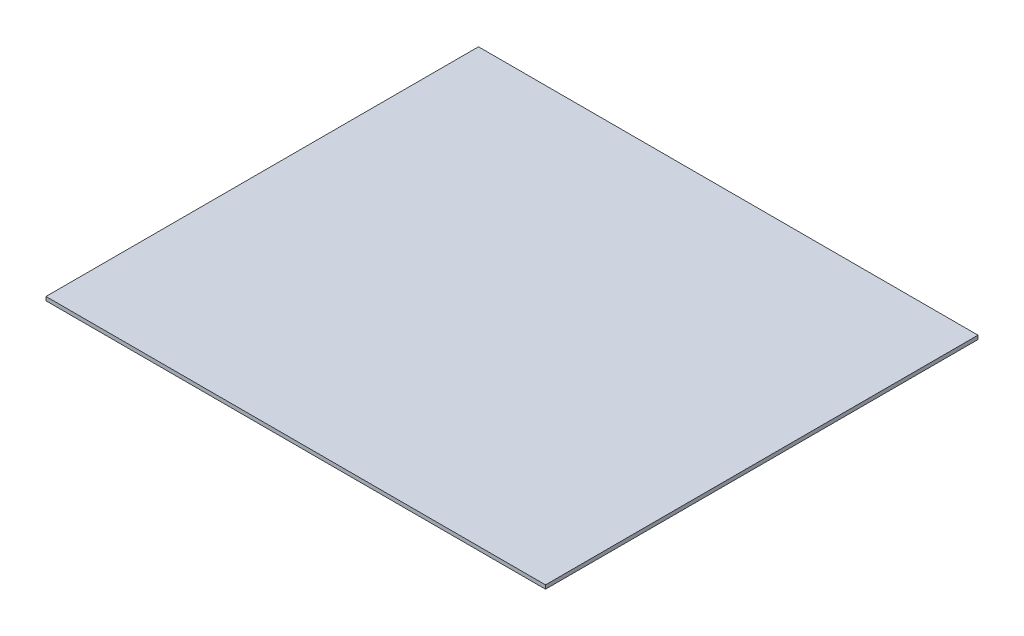
ISO-10303-21;
HEADER;
FILE_DESCRIPTION(('STEP AP214'),'2;1');
FILE_NAME('part.step','',(''),(''),'','','');
FILE_SCHEMA(('AUTOMOTIVE_DESIGN { 1 0 10303 214 1 1 1 1 }'));
ENDSEC;
DATA;
#1=APPLICATION_CONTEXT('core data for automotive mechanical design processes');
#2=APPLICATION_PROTOCOL_DEFINITION('international standard','automotive_design',2000,#1);
#3=PRODUCT_CONTEXT('',#1,'mechanical');
#4=PRODUCT('Part','Part','',(#3));
#5=PRODUCT_RELATED_PRODUCT_CATEGORY('part','',(#4));
#6=PRODUCT_DEFINITION_FORMATION('','',#4);
#7=PRODUCT_DEFINITION_CONTEXT('part definition',#1,'design');
#8=PRODUCT_DEFINITION('design','',#6,#7);
#9=PRODUCT_DEFINITION_SHAPE('','',#8);
#10=(LENGTH_UNIT() NAMED_UNIT(*) SI_UNIT(.MILLI.,.METRE.));
#11=(NAMED_UNIT(*) PLANE_ANGLE_UNIT() SI_UNIT($,.RADIAN.));
#12=(NAMED_UNIT(*) SI_UNIT($,.STERADIAN.) SOLID_ANGLE_UNIT());
#13=UNCERTAINTY_MEASURE_WITH_UNIT(LENGTH_MEASURE(1.E-05),#10,'distance_accuracy_value','');
#14=(GEOMETRIC_REPRESENTATION_CONTEXT(3) GLOBAL_UNCERTAINTY_ASSIGNED_CONTEXT((#13)) GLOBAL_UNIT_ASSIGNED_CONTEXT((#10,
#11,#12)) REPRESENTATION_CONTEXT('',''));
#15=CARTESIAN_POINT('',(0.,0.,0.));
#16=DIRECTION('',(0.,0.,1.));
#17=DIRECTION('',(1.,0.,0.));
#18=AXIS2_PLACEMENT_3D('',#15,#16,#17);
#19=CARTESIAN_POINT('',(-96.9721767594109,-0.01,-156.459901800327));
#20=DIRECTION('',(-1.,0.,0.));
#21=DIRECTION('',(0.,0.,1.));
#22=AXIS2_PLACEMENT_3D('',#19,#20,#21);
#23=PLANE('',#22);
#24=DIRECTION('',(0.,0.,1.));
#25=VECTOR('',#24,1.);
#26=CARTESIAN_POINT('',(-96.9721767594109,0.,0.));
#27=LINE('',#26,#25);
#28=CARTESIAN_POINT('',(-96.972176759411,0.,-156.459901800327));
#29=VERTEX_POINT('',#28);
#30=CARTESIAN_POINT('',(-96.972176759411,0.,185.540098199673));
#31=VERTEX_POINT('',#30);
#32=EDGE_CURVE('E90',#29,#31,#27,.T.);
#33=ORIENTED_EDGE('',*,*,#32,.F.);
#34=DIRECTION('',(0.,-1.,0.));
#35=VECTOR('',#34,1.);
#36=CARTESIAN_POINT('',(-96.9721767594109,3.,-156.459901800327));
#37=LINE('',#36,#35);
#38=CARTESIAN_POINT('',(-96.972176759411,3.,-156.459901800327));
#39=VERTEX_POINT('',#38);
#40=EDGE_CURVE('E94',#39,#29,#37,.T.);
#41=ORIENTED_EDGE('',*,*,#40,.F.);
#42=DIRECTION('',(0.,0.,1.));
#43=VECTOR('',#42,1.);
#44=CARTESIAN_POINT('',(-96.9721767594109,3.,0.));
#45=LINE('',#44,#43);
#46=CARTESIAN_POINT('',(-96.972176759411,3.,185.540098199673));
#47=VERTEX_POINT('',#46);
#48=EDGE_CURVE('E11',#39,#47,#45,.T.);
#49=ORIENTED_EDGE('',*,*,#48,.T.);
#50=DIRECTION('',(0.,1.,0.));
#51=VECTOR('',#50,1.);
#52=CARTESIAN_POINT('',(-96.9721767594109,3.,185.540098199673));
#53=LINE('',#52,#51);
#54=EDGE_CURVE('E37',#31,#47,#53,.T.);
#55=ORIENTED_EDGE('',*,*,#54,.F.);
#56=EDGE_LOOP('',(#33,#41,#49,#55));
#57=FACE_BOUND('',#56,.T.);
#58=ADVANCED_FACE('F34',(#57),#23,.F.);
#59=CARTESIAN_POINT('',(-491.972176759411,3.,-156.459901800327));
#60=DIRECTION('',(1.,0.,0.));
#61=DIRECTION('',(0.,0.,-1.));
#62=AXIS2_PLACEMENT_3D('',#59,#60,#61);
#63=PLANE('',#62);
#64=DIRECTION('',(0.,0.,1.));
#65=VECTOR('',#64,1.);
#66=CARTESIAN_POINT('',(-491.972176759411,0.,-156.459901800327));
#67=LINE('',#66,#65);
#68=CARTESIAN_POINT('',(-491.972176759411,0.,-156.459901800327));
#69=VERTEX_POINT('',#68);
#70=CARTESIAN_POINT('',(-491.972176759411,0.,185.540098199673));
#71=VERTEX_POINT('',#70);
#72=EDGE_CURVE('E89',#69,#71,#67,.T.);
#73=ORIENTED_EDGE('',*,*,#72,.T.);
#74=DIRECTION('',(0.,-1.,0.));
#75=VECTOR('',#74,1.);
#76=CARTESIAN_POINT('',(-491.972176759411,3.,185.540098199673));
#77=LINE('',#76,#75);
#78=CARTESIAN_POINT('',(-491.972176759411,3.,185.540098199673));
#79=VERTEX_POINT('',#78);
#80=EDGE_CURVE('E74',#79,#71,#77,.T.);
#81=ORIENTED_EDGE('',*,*,#80,.F.);
#82=DIRECTION('',(0.,0.,1.));
#83=VECTOR('',#82,1.);
#84=CARTESIAN_POINT('',(-491.972176759411,3.,-156.459901800327));
#85=LINE('',#84,#83);
#86=CARTESIAN_POINT('',(-491.972176759411,3.,-156.459901800327));
#87=VERTEX_POINT('',#86);
#88=EDGE_CURVE('E77',#87,#79,#85,.T.);
#89=ORIENTED_EDGE('',*,*,#88,.F.);
#90=DIRECTION('',(0.,-1.,0.));
#91=VECTOR('',#90,1.);
#92=CARTESIAN_POINT('',(-491.972176759411,3.,-156.459901800327));
#93=LINE('',#92,#91);
#94=EDGE_CURVE('E91',#87,#69,#93,.T.);
#95=ORIENTED_EDGE('',*,*,#94,.T.);
#96=EDGE_LOOP('',(#73,#81,#89,#95));
#97=FACE_BOUND('',#96,.T.);
#98=ADVANCED_FACE('F87',(#97),#63,.F.);
#99=CARTESIAN_POINT('',(-491.972176759411,3.,185.540098199673));
#100=DIRECTION('',(0.,0.,-1.));
#101=DIRECTION('',(-1.,0.,0.));
#102=AXIS2_PLACEMENT_3D('',#99,#100,#101);
#103=PLANE('',#102);
#104=DIRECTION('',(1.,0.,0.));
#105=VECTOR('',#104,1.);
#106=CARTESIAN_POINT('',(-491.972176759411,0.,185.540098199673));
#107=LINE('',#106,#105);
#108=EDGE_CURVE('E105',#71,#31,#107,.T.);
#109=ORIENTED_EDGE('',*,*,#108,.T.);
#110=ORIENTED_EDGE('',*,*,#54,.T.);
#111=DIRECTION('',(1.,0.,0.));
#112=VECTOR('',#111,1.);
#113=CARTESIAN_POINT('',(-491.972176759411,3.,185.540098199673));
#114=LINE('',#113,#112);
#115=EDGE_CURVE('E70',#79,#47,#114,.T.);
#116=ORIENTED_EDGE('',*,*,#115,.F.);
#117=ORIENTED_EDGE('',*,*,#80,.T.);
#118=EDGE_LOOP('',(#109,#110,#116,#117));
#119=FACE_BOUND('',#118,.T.);
#120=ADVANCED_FACE('F72',(#119),#103,.F.);
#121=CARTESIAN_POINT('',(-491.972176759411,3.,-156.459901800327));
#122=DIRECTION('',(0.,0.,1.));
#123=DIRECTION('',(1.,0.,0.));
#124=AXIS2_PLACEMENT_3D('',#121,#122,#123);
#125=PLANE('',#124);
#126=DIRECTION('',(-1.,0.,0.));
#127=VECTOR('',#126,1.);
#128=CARTESIAN_POINT('',(-491.972176759411,3.,-156.459901800327));
#129=LINE('',#128,#127);
#130=EDGE_CURVE('E76',#39,#87,#129,.T.);
#131=ORIENTED_EDGE('',*,*,#130,.F.);
#132=ORIENTED_EDGE('',*,*,#40,.T.);
#133=DIRECTION('',(-1.,0.,0.));
#134=VECTOR('',#133,1.);
#135=CARTESIAN_POINT('',(-491.972176759411,0.,-156.459901800327));
#136=LINE('',#135,#134);
#137=EDGE_CURVE('E85',#29,#69,#136,.T.);
#138=ORIENTED_EDGE('',*,*,#137,.T.);
#139=ORIENTED_EDGE('',*,*,#94,.F.);
#140=EDGE_LOOP('',(#131,#132,#138,#139));
#141=FACE_BOUND('',#140,.T.);
#142=ADVANCED_FACE('F100',(#141),#125,.F.);
#143=CARTESIAN_POINT('',(0.,0.,0.));
#144=DIRECTION('',(0.,1.,0.));
#145=DIRECTION('',(0.,0.,1.));
#146=AXIS2_PLACEMENT_3D('',#143,#144,#145);
#147=PLANE('',#146);
#148=ORIENTED_EDGE('',*,*,#137,.F.);
#149=ORIENTED_EDGE('',*,*,#32,.T.);
#150=ORIENTED_EDGE('',*,*,#108,.F.);
#151=ORIENTED_EDGE('',*,*,#72,.F.);
#152=EDGE_LOOP('',(#148,#149,#150,#151));
#153=FACE_BOUND('',#152,.T.);
#154=ADVANCED_FACE('F104',(#153),#147,.F.);
#155=CARTESIAN_POINT('',(0.,3.,0.));
#156=DIRECTION('',(0.,1.,0.));
#157=DIRECTION('',(0.,0.,1.));
#158=AXIS2_PLACEMENT_3D('',#155,#156,#157);
#159=PLANE('',#158);
#160=ORIENTED_EDGE('',*,*,#48,.F.);
#161=ORIENTED_EDGE('',*,*,#130,.T.);
#162=ORIENTED_EDGE('',*,*,#88,.T.);
#163=ORIENTED_EDGE('',*,*,#115,.T.);
#164=EDGE_LOOP('',(#160,#161,#162,#163));
#165=FACE_BOUND('',#164,.T.);
#166=ADVANCED_FACE('F80',(#165),#159,.T.);
#167=CLOSED_SHELL('',(#58,#98,#120,#142,#154,#166));
#168=MANIFOLD_SOLID_BREP('B2',#167);
#169=ADVANCED_BREP_SHAPE_REPRESENTATION('',(#18,#168),#14);
#170=SHAPE_DEFINITION_REPRESENTATION(#9,#169);
ENDSEC;
END-ISO-10303-21;
